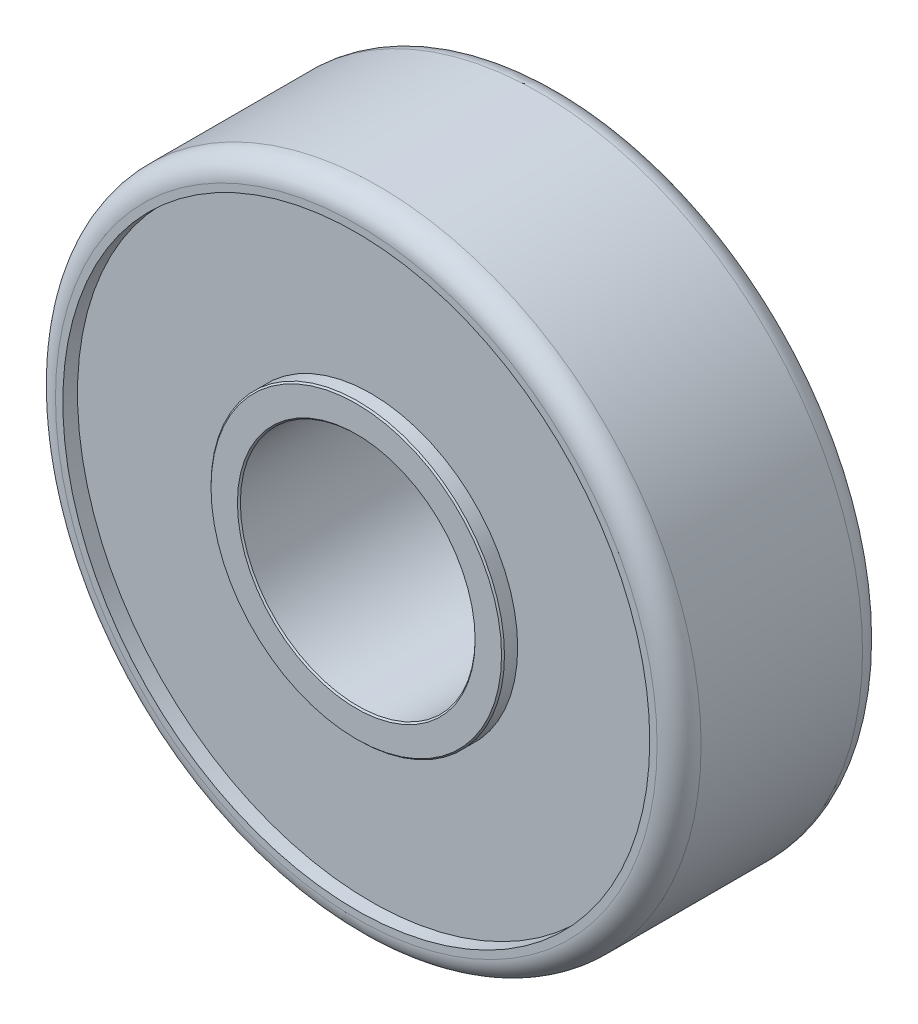
ISO-10303-21;
HEADER;
FILE_DESCRIPTION(('STEP AP214'),'2;1');
FILE_NAME('part.step','',(''),(''),'','','');
FILE_SCHEMA(('AUTOMOTIVE_DESIGN { 1 0 10303 214 1 1 1 1 }'));
ENDSEC;
DATA;
#1=APPLICATION_CONTEXT('core data for automotive mechanical design processes');
#2=APPLICATION_PROTOCOL_DEFINITION('international standard','automotive_design',2000,#1);
#3=PRODUCT_CONTEXT('',#1,'mechanical');
#4=PRODUCT('Part','Part','',(#3));
#5=PRODUCT_RELATED_PRODUCT_CATEGORY('part','',(#4));
#6=PRODUCT_DEFINITION_FORMATION('','',#4);
#7=PRODUCT_DEFINITION_CONTEXT('part definition',#1,'design');
#8=PRODUCT_DEFINITION('design','',#6,#7);
#9=PRODUCT_DEFINITION_SHAPE('','',#8);
#10=(LENGTH_UNIT() NAMED_UNIT(*) SI_UNIT(.MILLI.,.METRE.));
#11=(NAMED_UNIT(*) PLANE_ANGLE_UNIT() SI_UNIT($,.RADIAN.));
#12=(NAMED_UNIT(*) SI_UNIT($,.STERADIAN.) SOLID_ANGLE_UNIT());
#13=UNCERTAINTY_MEASURE_WITH_UNIT(LENGTH_MEASURE(1.E-05),#10,'distance_accuracy_value','');
#14=(GEOMETRIC_REPRESENTATION_CONTEXT(3) GLOBAL_UNCERTAINTY_ASSIGNED_CONTEXT((#13)) GLOBAL_UNIT_ASSIGNED_CONTEXT((#10,
#11,#12)) REPRESENTATION_CONTEXT('',''));
#15=CARTESIAN_POINT('',(0.,0.,0.));
#16=DIRECTION('',(0.,0.,1.));
#17=DIRECTION('',(1.,0.,0.));
#18=AXIS2_PLACEMENT_3D('',#15,#16,#17);
#19=CARTESIAN_POINT('',(0.,0.,0.));
#20=DIRECTION('',(0.,0.,1.));
#21=DIRECTION('',(1.,0.,0.));
#22=AXIS2_PLACEMENT_3D('',#19,#20,#21);
#23=PLANE('',#22);
#24=CARTESIAN_POINT('',(0.,0.,0.));
#25=DIRECTION('',(0.,0.,1.));
#26=DIRECTION('',(1.,0.,0.));
#27=AXIS2_PLACEMENT_3D('',#24,#25,#26);
#28=CIRCLE('',#27,4.95);
#29=CARTESIAN_POINT('',(4.95,0.,0.));
#30=VERTEX_POINT('',#29);
#31=EDGE_CURVE('E61',#30,#30,#28,.F.);
#32=ORIENTED_EDGE('',*,*,#31,.T.);
#33=EDGE_LOOP('',(#32));
#34=FACE_BOUND('',#33,.T.);
#35=CARTESIAN_POINT('',(0.,0.,0.));
#36=DIRECTION('',(0.,0.,1.));
#37=DIRECTION('',(1.,0.,0.));
#38=AXIS2_PLACEMENT_3D('',#35,#36,#37);
#39=CIRCLE('',#38,4.05000000000001);
#40=CARTESIAN_POINT('',(4.05000000000001,0.,0.));
#41=VERTEX_POINT('',#40);
#42=EDGE_CURVE('E64',#41,#41,#39,.T.);
#43=ORIENTED_EDGE('',*,*,#42,.T.);
#44=EDGE_LOOP('',(#43));
#45=FACE_BOUND('',#44,.T.);
#46=ADVANCED_FACE('F35',(#34,#45),#23,.F.);
#47=CARTESIAN_POINT('',(0.,0.,7.));
#48=DIRECTION('',(0.,0.,1.));
#49=DIRECTION('',(1.,0.,0.));
#50=AXIS2_PLACEMENT_3D('',#47,#48,#49);
#51=PLANE('',#50);
#52=CARTESIAN_POINT('',(0.,0.,7.));
#53=DIRECTION('',(0.,0.,1.));
#54=DIRECTION('',(1.,0.,0.));
#55=AXIS2_PLACEMENT_3D('',#52,#53,#54);
#56=CIRCLE('',#55,4.95);
#57=CARTESIAN_POINT('',(-4.95,0.,7.));
#58=VERTEX_POINT('',#57);
#59=EDGE_CURVE('E42',#58,#58,#56,.T.);
#60=ORIENTED_EDGE('',*,*,#59,.T.);
#61=EDGE_LOOP('',(#60));
#62=FACE_BOUND('',#61,.T.);
#63=CARTESIAN_POINT('',(0.,0.,7.));
#64=DIRECTION('',(0.,0.,1.));
#65=DIRECTION('',(1.,0.,0.));
#66=AXIS2_PLACEMENT_3D('',#63,#64,#65);
#67=CIRCLE('',#66,4.05);
#68=CARTESIAN_POINT('',(4.05,0.,7.));
#69=VERTEX_POINT('',#68);
#70=EDGE_CURVE('E46',#69,#69,#67,.F.);
#71=ORIENTED_EDGE('',*,*,#70,.T.);
#72=EDGE_LOOP('',(#71));
#73=FACE_BOUND('',#72,.T.);
#74=ADVANCED_FACE('F126',(#62,#73),#51,.T.);
#75=CARTESIAN_POINT('',(0.,0.,7.));
#76=DIRECTION('',(0.,0.,1.));
#77=DIRECTION('',(1.,0.,0.));
#78=AXIS2_PLACEMENT_3D('',#75,#76,#77);
#79=CIRCLE('',#78,10.25);
#80=CARTESIAN_POINT('',(10.25,0.,7.));
#81=VERTEX_POINT('',#80);
#82=EDGE_CURVE('E67',#81,#81,#79,.T.);
#83=ORIENTED_EDGE('',*,*,#82,.T.);
#84=EDGE_LOOP('',(#83));
#85=FACE_BOUND('',#84,.T.);
#86=CARTESIAN_POINT('',(0.,0.,7.));
#87=DIRECTION('',(0.,0.,1.));
#88=DIRECTION('',(1.,0.,0.));
#89=AXIS2_PLACEMENT_3D('',#86,#87,#88);
#90=CIRCLE('',#89,10.);
#91=CARTESIAN_POINT('',(10.,0.,7.));
#92=VERTEX_POINT('',#91);
#93=EDGE_CURVE('E80',#92,#92,#90,.T.);
#94=ORIENTED_EDGE('',*,*,#93,.F.);
#95=EDGE_LOOP('',(#94));
#96=FACE_BOUND('',#95,.T.);
#97=ADVANCED_FACE('F116',(#85,#96),#51,.T.);
#98=CARTESIAN_POINT('',(0.,0.,0.));
#99=DIRECTION('',(0.,0.,1.));
#100=DIRECTION('',(1.,0.,0.));
#101=AXIS2_PLACEMENT_3D('',#98,#99,#100);
#102=CIRCLE('',#101,10.25);
#103=CARTESIAN_POINT('',(10.25,0.,0.));
#104=VERTEX_POINT('',#103);
#105=EDGE_CURVE('E70',#104,#104,#102,.F.);
#106=ORIENTED_EDGE('',*,*,#105,.T.);
#107=EDGE_LOOP('',(#106));
#108=FACE_BOUND('',#107,.T.);
#109=CARTESIAN_POINT('',(0.,0.,0.));
#110=DIRECTION('',(0.,0.,-1.));
#111=DIRECTION('',(-1.,0.,0.));
#112=AXIS2_PLACEMENT_3D('',#109,#110,#111);
#113=CIRCLE('',#112,10.);
#114=CARTESIAN_POINT('',(-10.,0.,0.));
#115=VERTEX_POINT('',#114);
#116=EDGE_CURVE('E89',#115,#115,#113,.T.);
#117=ORIENTED_EDGE('',*,*,#116,.F.);
#118=EDGE_LOOP('',(#117));
#119=FACE_BOUND('',#118,.T.);
#120=ADVANCED_FACE('F113',(#108,#119),#23,.F.);
#121=CARTESIAN_POINT('',(0.,0.,7.));
#122=DIRECTION('',(0.,0.,-1.));
#123=DIRECTION('',(-1.,0.,0.));
#124=AXIS2_PLACEMENT_3D('',#121,#122,#123);
#125=CYLINDRICAL_SURFACE('',#124,11.);
#126=CARTESIAN_POINT('',(0.,0.,0.75));
#127=DIRECTION('',(0.,0.,1.));
#128=DIRECTION('',(1.,0.,0.));
#129=AXIS2_PLACEMENT_3D('',#126,#127,#128);
#130=CIRCLE('',#129,11.);
#131=CARTESIAN_POINT('',(11.,0.,0.75));
#132=VERTEX_POINT('',#131);
#133=EDGE_CURVE('E73',#132,#132,#130,.T.);
#134=ORIENTED_EDGE('',*,*,#133,.T.);
#135=EDGE_LOOP('',(#134));
#136=FACE_BOUND('',#135,.T.);
#137=CARTESIAN_POINT('',(0.,0.,6.25));
#138=DIRECTION('',(0.,0.,1.));
#139=DIRECTION('',(1.,0.,0.));
#140=AXIS2_PLACEMENT_3D('',#137,#138,#139);
#141=CIRCLE('',#140,11.);
#142=CARTESIAN_POINT('',(11.,0.,6.25));
#143=VERTEX_POINT('',#142);
#144=EDGE_CURVE('E76',#143,#143,#141,.F.);
#145=ORIENTED_EDGE('',*,*,#144,.T.);
#146=EDGE_LOOP('',(#145));
#147=FACE_BOUND('',#146,.T.);
#148=ADVANCED_FACE('F115',(#136,#147),#125,.T.);
#149=CARTESIAN_POINT('',(0.,0.,7.));
#150=DIRECTION('',(0.,0.,-1.));
#151=DIRECTION('',(-1.,0.,0.));
#152=AXIS2_PLACEMENT_3D('',#149,#150,#151);
#153=CYLINDRICAL_SURFACE('',#152,4.);
#154=CARTESIAN_POINT('',(0.,0.,0.0500000000000014));
#155=DIRECTION('',(0.,0.,1.));
#156=DIRECTION('',(1.,0.,0.));
#157=AXIS2_PLACEMENT_3D('',#154,#155,#156);
#158=CIRCLE('',#157,4.);
#159=CARTESIAN_POINT('',(4.,0.,0.0500000000000014));
#160=VERTEX_POINT('',#159);
#161=EDGE_CURVE('E50',#160,#160,#158,.F.);
#162=ORIENTED_EDGE('',*,*,#161,.T.);
#163=EDGE_LOOP('',(#162));
#164=FACE_BOUND('',#163,.T.);
#165=CARTESIAN_POINT('',(0.,0.,6.95));
#166=DIRECTION('',(0.,0.,1.));
#167=DIRECTION('',(1.,0.,0.));
#168=AXIS2_PLACEMENT_3D('',#165,#166,#167);
#169=CIRCLE('',#168,4.);
#170=CARTESIAN_POINT('',(4.,0.,6.95));
#171=VERTEX_POINT('',#170);
#172=EDGE_CURVE('E55',#171,#171,#169,.T.);
#173=ORIENTED_EDGE('',*,*,#172,.T.);
#174=EDGE_LOOP('',(#173));
#175=FACE_BOUND('',#174,.T.);
#176=ADVANCED_FACE('F123',(#164,#175),#153,.F.);
#177=CARTESIAN_POINT('',(0.,0.,6.5));
#178=DIRECTION('',(0.,0.,1.));
#179=DIRECTION('',(1.,0.,0.));
#180=AXIS2_PLACEMENT_3D('',#177,#178,#179);
#181=CYLINDRICAL_SURFACE('',#180,10.);
#182=CARTESIAN_POINT('',(0.,0.,6.5));
#183=DIRECTION('',(0.,0.,1.));
#184=DIRECTION('',(1.,0.,0.));
#185=AXIS2_PLACEMENT_3D('',#182,#183,#184);
#186=CIRCLE('',#185,10.);
#187=CARTESIAN_POINT('',(10.,0.,6.5));
#188=VERTEX_POINT('',#187);
#189=EDGE_CURVE('E79',#188,#188,#186,.T.);
#190=ORIENTED_EDGE('',*,*,#189,.F.);
#191=EDGE_LOOP('',(#190));
#192=FACE_BOUND('',#191,.T.);
#193=ORIENTED_EDGE('',*,*,#93,.T.);
#194=EDGE_LOOP('',(#193));
#195=FACE_BOUND('',#194,.T.);
#196=ADVANCED_FACE('F175',(#192,#195),#181,.F.);
#197=CARTESIAN_POINT('',(0.,0.,6.5));
#198=DIRECTION('',(0.,0.,1.));
#199=DIRECTION('',(1.,0.,0.));
#200=AXIS2_PLACEMENT_3D('',#197,#198,#199);
#201=PLANE('',#200);
#202=CARTESIAN_POINT('',(0.,0.,6.5));
#203=DIRECTION('',(0.,0.,1.));
#204=DIRECTION('',(1.,0.,0.));
#205=AXIS2_PLACEMENT_3D('',#202,#203,#204);
#206=CIRCLE('',#205,5.);
#207=CARTESIAN_POINT('',(5.,0.,6.5));
#208=VERTEX_POINT('',#207);
#209=EDGE_CURVE('E83',#208,#208,#206,.T.);
#210=ORIENTED_EDGE('',*,*,#209,.F.);
#211=EDGE_LOOP('',(#210));
#212=FACE_BOUND('',#211,.T.);
#213=ORIENTED_EDGE('',*,*,#189,.T.);
#214=EDGE_LOOP('',(#213));
#215=FACE_BOUND('',#214,.T.);
#216=ADVANCED_FACE('F177',(#212,#215),#201,.T.);
#217=CARTESIAN_POINT('',(0.,0.,6.5));
#218=DIRECTION('',(0.,0.,1.));
#219=DIRECTION('',(1.,0.,0.));
#220=AXIS2_PLACEMENT_3D('',#217,#218,#219);
#221=CYLINDRICAL_SURFACE('',#220,5.);
#222=CARTESIAN_POINT('',(0.,0.,6.95));
#223=DIRECTION('',(0.,0.,1.));
#224=DIRECTION('',(1.,0.,0.));
#225=AXIS2_PLACEMENT_3D('',#222,#223,#224);
#226=CIRCLE('',#225,5.);
#227=CARTESIAN_POINT('',(-5.,0.,6.95));
#228=VERTEX_POINT('',#227);
#229=EDGE_CURVE('E10',#228,#228,#226,.F.);
#230=ORIENTED_EDGE('',*,*,#229,.T.);
#231=EDGE_LOOP('',(#230));
#232=FACE_BOUND('',#231,.T.);
#233=ORIENTED_EDGE('',*,*,#209,.T.);
#234=EDGE_LOOP('',(#233));
#235=FACE_BOUND('',#234,.T.);
#236=ADVANCED_FACE('F109',(#232,#235),#221,.T.);
#237=CARTESIAN_POINT('',(0.,0.,0.5));
#238=DIRECTION('',(0.,0.,-1.));
#239=DIRECTION('',(-1.,0.,0.));
#240=AXIS2_PLACEMENT_3D('',#237,#238,#239);
#241=CYLINDRICAL_SURFACE('',#240,10.);
#242=CARTESIAN_POINT('',(0.,0.,0.5));
#243=DIRECTION('',(0.,0.,-1.));
#244=DIRECTION('',(-1.,0.,0.));
#245=AXIS2_PLACEMENT_3D('',#242,#243,#244);
#246=CIRCLE('',#245,10.);
#247=CARTESIAN_POINT('',(-10.,0.,0.5));
#248=VERTEX_POINT('',#247);
#249=EDGE_CURVE('E88',#248,#248,#246,.T.);
#250=ORIENTED_EDGE('',*,*,#249,.F.);
#251=EDGE_LOOP('',(#250));
#252=FACE_BOUND('',#251,.T.);
#253=ORIENTED_EDGE('',*,*,#116,.T.);
#254=EDGE_LOOP('',(#253));
#255=FACE_BOUND('',#254,.T.);
#256=ADVANCED_FACE('F103',(#252,#255),#241,.F.);
#257=CARTESIAN_POINT('',(0.,0.,0.5));
#258=DIRECTION('',(0.,0.,-1.));
#259=DIRECTION('',(-1.,0.,0.));
#260=AXIS2_PLACEMENT_3D('',#257,#258,#259);
#261=PLANE('',#260);
#262=CARTESIAN_POINT('',(0.,0.,0.5));
#263=DIRECTION('',(0.,0.,-1.));
#264=DIRECTION('',(-1.,0.,0.));
#265=AXIS2_PLACEMENT_3D('',#262,#263,#264);
#266=CIRCLE('',#265,5.);
#267=CARTESIAN_POINT('',(-5.,0.,0.5));
#268=VERTEX_POINT('',#267);
#269=EDGE_CURVE('E92',#268,#268,#266,.T.);
#270=ORIENTED_EDGE('',*,*,#269,.F.);
#271=EDGE_LOOP('',(#270));
#272=FACE_BOUND('',#271,.T.);
#273=ORIENTED_EDGE('',*,*,#249,.T.);
#274=EDGE_LOOP('',(#273));
#275=FACE_BOUND('',#274,.T.);
#276=ADVANCED_FACE('F100',(#272,#275),#261,.T.);
#277=CARTESIAN_POINT('',(0.,0.,0.5));
#278=DIRECTION('',(0.,0.,-1.));
#279=DIRECTION('',(-1.,0.,0.));
#280=AXIS2_PLACEMENT_3D('',#277,#278,#279);
#281=CYLINDRICAL_SURFACE('',#280,5.);
#282=CARTESIAN_POINT('',(0.,0.,0.0500000000000006));
#283=DIRECTION('',(0.,0.,1.));
#284=DIRECTION('',(1.,0.,0.));
#285=AXIS2_PLACEMENT_3D('',#282,#283,#284);
#286=CIRCLE('',#285,5.);
#287=CARTESIAN_POINT('',(5.,0.,0.0500000000000006));
#288=VERTEX_POINT('',#287);
#289=EDGE_CURVE('E58',#288,#288,#286,.T.);
#290=ORIENTED_EDGE('',*,*,#289,.T.);
#291=EDGE_LOOP('',(#290));
#292=FACE_BOUND('',#291,.T.);
#293=ORIENTED_EDGE('',*,*,#269,.T.);
#294=EDGE_LOOP('',(#293));
#295=FACE_BOUND('',#294,.T.);
#296=ADVANCED_FACE('F98',(#292,#295),#281,.T.);
#297=CARTESIAN_POINT('',(0.,0.,0.75));
#298=DIRECTION('',(0.,0.,1.));
#299=DIRECTION('',(1.,0.,0.));
#300=AXIS2_PLACEMENT_3D('',#297,#298,#299);
#301=TOROIDAL_SURFACE('',#300,10.25,0.75);
#302=ORIENTED_EDGE('',*,*,#105,.F.);
#303=EDGE_LOOP('',(#302));
#304=FACE_BOUND('',#303,.T.);
#305=ORIENTED_EDGE('',*,*,#133,.F.);
#306=EDGE_LOOP('',(#305));
#307=FACE_BOUND('',#306,.T.);
#308=ADVANCED_FACE('F156',(#304,#307),#301,.T.);
#309=CARTESIAN_POINT('',(0.,0.,6.25));
#310=DIRECTION('',(0.,0.,1.));
#311=DIRECTION('',(1.,0.,0.));
#312=AXIS2_PLACEMENT_3D('',#309,#310,#311);
#313=TOROIDAL_SURFACE('',#312,10.25,0.75);
#314=ORIENTED_EDGE('',*,*,#144,.F.);
#315=EDGE_LOOP('',(#314));
#316=FACE_BOUND('',#315,.T.);
#317=ORIENTED_EDGE('',*,*,#82,.F.);
#318=EDGE_LOOP('',(#317));
#319=FACE_BOUND('',#318,.T.);
#320=ADVANCED_FACE('F149',(#316,#319),#313,.T.);
#321=CARTESIAN_POINT('',(0.,0.,0.));
#322=DIRECTION('',(0.,0.,1.));
#323=DIRECTION('',(1.,0.,0.));
#324=AXIS2_PLACEMENT_3D('',#321,#322,#323);
#325=CONICAL_SURFACE('',#324,4.95,0.785398163397483);
#326=ORIENTED_EDGE('',*,*,#289,.F.);
#327=EDGE_LOOP('',(#326));
#328=FACE_BOUND('',#327,.T.);
#329=ORIENTED_EDGE('',*,*,#31,.F.);
#330=EDGE_LOOP('',(#329));
#331=FACE_BOUND('',#330,.T.);
#332=ADVANCED_FACE('F141',(#328,#331),#325,.T.);
#333=CARTESIAN_POINT('',(0.,0.,0.));
#334=DIRECTION('',(0.,0.,-1.));
#335=DIRECTION('',(-1.,0.,0.));
#336=AXIS2_PLACEMENT_3D('',#333,#334,#335);
#337=CONICAL_SURFACE('',#336,4.05000000000001,0.785398163397483);
#338=ORIENTED_EDGE('',*,*,#161,.F.);
#339=EDGE_LOOP('',(#338));
#340=FACE_BOUND('',#339,.T.);
#341=ORIENTED_EDGE('',*,*,#42,.F.);
#342=EDGE_LOOP('',(#341));
#343=FACE_BOUND('',#342,.T.);
#344=ADVANCED_FACE('F138',(#340,#343),#337,.F.);
#345=CARTESIAN_POINT('',(0.,0.,7.));
#346=DIRECTION('',(0.,0.,-1.));
#347=DIRECTION('',(-1.,0.,0.));
#348=AXIS2_PLACEMENT_3D('',#345,#346,#347);
#349=CONICAL_SURFACE('',#348,4.95,0.785398163397448);
#350=CARTESIAN_POINT('',(-5.,0.,6.95));
#351=CARTESIAN_POINT('',(-4.99947916666667,0.,6.95052083333334));
#352=CARTESIAN_POINT('',(-4.99895833333333,0.,6.95104166666667));
#353=CARTESIAN_POINT('',(-4.99791666666667,0.,6.95208333333334));
#354=CARTESIAN_POINT('',(-4.99739583333333,0.,6.95260416666667));
#355=CARTESIAN_POINT('',(-4.99635416666667,0.,6.95364583333334));
#356=CARTESIAN_POINT('',(-4.99583333333333,0.,6.95416666666667));
#357=CARTESIAN_POINT('',(-4.99479166666667,0.,6.95520833333334));
#358=CARTESIAN_POINT('',(-4.99427083333333,0.,6.95572916666667));
#359=CARTESIAN_POINT('',(-4.99322916666667,0.,6.95677083333334));
#360=CARTESIAN_POINT('',(-4.99270833333333,0.,6.95729166666667));
#361=CARTESIAN_POINT('',(-4.99166666666667,0.,6.95833333333334));
#362=CARTESIAN_POINT('',(-4.99114583333333,0.,6.95885416666667));
#363=CARTESIAN_POINT('',(-4.99010416666667,0.,6.95989583333334));
#364=CARTESIAN_POINT('',(-4.98958333333333,0.,6.96041666666667));
#365=CARTESIAN_POINT('',(-4.98854166666667,0.,6.96145833333334));
#366=CARTESIAN_POINT('',(-4.98802083333333,0.,6.96197916666667));
#367=CARTESIAN_POINT('',(-4.98697916666667,0.,6.96302083333333));
#368=CARTESIAN_POINT('',(-4.98645833333333,0.,6.96354166666667));
#369=CARTESIAN_POINT('',(-4.98541666666667,0.,6.96458333333333));
#370=CARTESIAN_POINT('',(-4.98489583333334,0.,6.96510416666667));
#371=CARTESIAN_POINT('',(-4.98385416666667,0.,6.96614583333333));
#372=CARTESIAN_POINT('',(-4.98333333333333,0.,6.96666666666667));
#373=CARTESIAN_POINT('',(-4.98229166666667,0.,6.96770833333334));
#374=CARTESIAN_POINT('',(-4.98177083333333,0.,6.96822916666667));
#375=CARTESIAN_POINT('',(-4.98072916666667,0.,6.96927083333334));
#376=CARTESIAN_POINT('',(-4.98020833333333,0.,6.96979166666667));
#377=CARTESIAN_POINT('',(-4.97916666666667,0.,6.97083333333333));
#378=CARTESIAN_POINT('',(-4.97864583333333,0.,6.97135416666667));
#379=CARTESIAN_POINT('',(-4.97760416666667,0.,6.97239583333333));
#380=CARTESIAN_POINT('',(-4.97708333333334,0.,6.97291666666667));
#381=CARTESIAN_POINT('',(-4.97604166666667,0.,6.97395833333333));
#382=CARTESIAN_POINT('',(-4.97552083333334,0.,6.97447916666667));
#383=CARTESIAN_POINT('',(-4.97447916666667,0.,6.97552083333333));
#384=CARTESIAN_POINT('',(-4.97395833333334,0.,6.97604166666667));
#385=CARTESIAN_POINT('',(-4.97291666666667,0.,6.97708333333333));
#386=CARTESIAN_POINT('',(-4.97239583333334,0.,6.97760416666667));
#387=CARTESIAN_POINT('',(-4.97135416666667,0.,6.97864583333333));
#388=CARTESIAN_POINT('',(-4.97083333333334,0.,6.97916666666667));
#389=CARTESIAN_POINT('',(-4.96979166666667,0.,6.98020833333333));
#390=CARTESIAN_POINT('',(-4.96927083333334,0.,6.98072916666667));
#391=CARTESIAN_POINT('',(-4.96822916666667,0.,6.98177083333333));
#392=CARTESIAN_POINT('',(-4.96770833333334,0.,6.98229166666667));
#393=CARTESIAN_POINT('',(-4.96666666666667,0.,6.98333333333333));
#394=CARTESIAN_POINT('',(-4.96614583333334,0.,6.98385416666667));
#395=CARTESIAN_POINT('',(-4.96510416666667,0.,6.98489583333333));
#396=CARTESIAN_POINT('',(-4.96458333333334,0.,6.98541666666667));
#397=CARTESIAN_POINT('',(-4.96354166666667,0.,6.98645833333333));
#398=CARTESIAN_POINT('',(-4.96302083333334,0.,6.98697916666667));
#399=CARTESIAN_POINT('',(-4.96197916666667,0.,6.98802083333333));
#400=CARTESIAN_POINT('',(-4.96145833333334,0.,6.98854166666667));
#401=CARTESIAN_POINT('',(-4.96041666666667,0.,6.98958333333333));
#402=CARTESIAN_POINT('',(-4.95989583333334,0.,6.99010416666667));
#403=CARTESIAN_POINT('',(-4.95885416666667,0.,6.99114583333333));
#404=CARTESIAN_POINT('',(-4.95833333333334,0.,6.99166666666667));
#405=CARTESIAN_POINT('',(-4.95729166666667,0.,6.99270833333333));
#406=CARTESIAN_POINT('',(-4.95677083333334,0.,6.99322916666667));
#407=CARTESIAN_POINT('',(-4.95572916666667,0.,6.99427083333333));
#408=CARTESIAN_POINT('',(-4.95520833333334,0.,6.99479166666667));
#409=CARTESIAN_POINT('',(-4.95416666666667,0.,6.99583333333333));
#410=CARTESIAN_POINT('',(-4.95364583333334,0.,6.99635416666667));
#411=CARTESIAN_POINT('',(-4.95260416666667,0.,6.99739583333333));
#412=CARTESIAN_POINT('',(-4.95208333333334,0.,6.99791666666667));
#413=CARTESIAN_POINT('',(-4.95104166666667,0.,6.99895833333333));
#414=CARTESIAN_POINT('',(-4.95052083333334,0.,6.99947916666667));
#415=CARTESIAN_POINT('',(-4.95,0.,7.));
#416=B_SPLINE_CURVE_WITH_KNOTS('',3,(#350,#351,#352,#353,#354,#355,#356,#357,#358,#359,#360,
#361,#362,#363,#364,#365,#366,#367,#368,#369,#370,#371,#372,#373,#374,#375,#376,#377,#378,#379,
#380,#381,#382,#383,#384,#385,#386,#387,#388,#389,#390,#391,#392,#393,#394,#395,#396,#397,#398,
#399,#400,#401,#402,#403,#404,#405,#406,#407,#408,#409,#410,#411,#412,#413,#414,#415),
.UNSPECIFIED.,.F.,.F.,(4,2,2,2,2,2,2,2,2,2,2,2,2,2,2,2,2,2,2,2,2,2,2,2,2,2,2,2,2,2,2,2,4),(0.,
0.00220970869120894,0.00441941738241666,0.00662912607362438,0.0088388347648321,
0.0110485434560398,0.0132582521472475,0.0154679608384552,0.017677669529663,0.0198873782208707,
0.0220970869120784,0.0243067956032873,0.0265165042944951,0.0287262129857028,0.0309359216769105,
0.0331456303681182,0.0353553390593259,0.0375650477505337,0.0397747564417414,0.0419844651329491,
0.0441941738241568,0.0464038825153645,0.0486135912065735,0.0508232998977812,0.0530330085889889,
0.0552427172801966,0.0574524259714044,0.0596621346626121,0.0618718433538198,0.0640815520450275,
0.0662912607362352,0.068500969427443,0.0707106781186519),.UNSPECIFIED.);
#417=EDGE_CURVE('BSEAM140',#228,#58,#416,.T.);
#418=ORIENTED_EDGE('',*,*,#229,.F.);
#419=ORIENTED_EDGE('',*,*,#59,.F.);
#420=ORIENTED_EDGE('',*,*,#417,.T.);
#421=ORIENTED_EDGE('',*,*,#417,.F.);
#422=EDGE_LOOP('',(#418,#420,#419,#421));
#423=FACE_BOUND('',#422,.T.);
#424=ADVANCED_FACE('F140',(#423),#349,.T.);
#425=CARTESIAN_POINT('',(0.,0.,6.95));
#426=DIRECTION('',(0.,0.,1.));
#427=DIRECTION('',(1.,0.,0.));
#428=AXIS2_PLACEMENT_3D('',#425,#426,#427);
#429=CONICAL_SURFACE('',#428,4.,0.785398163397448);
#430=ORIENTED_EDGE('',*,*,#70,.F.);
#431=EDGE_LOOP('',(#430));
#432=FACE_BOUND('',#431,.T.);
#433=ORIENTED_EDGE('',*,*,#172,.F.);
#434=EDGE_LOOP('',(#433));
#435=FACE_BOUND('',#434,.T.);
#436=ADVANCED_FACE('F37',(#432,#435),#429,.F.);
#437=CLOSED_SHELL('',(#46,#74,#97,#120,#148,#176,#196,#216,#236,#256,#276,#296,#308,#320,#332,
#344,#424,#436));
#438=MANIFOLD_SOLID_BREP('B2',#437);
#439=ADVANCED_BREP_SHAPE_REPRESENTATION('',(#18,#438),#14);
#440=SHAPE_DEFINITION_REPRESENTATION(#9,#439);
ENDSEC;
END-ISO-10303-21;
